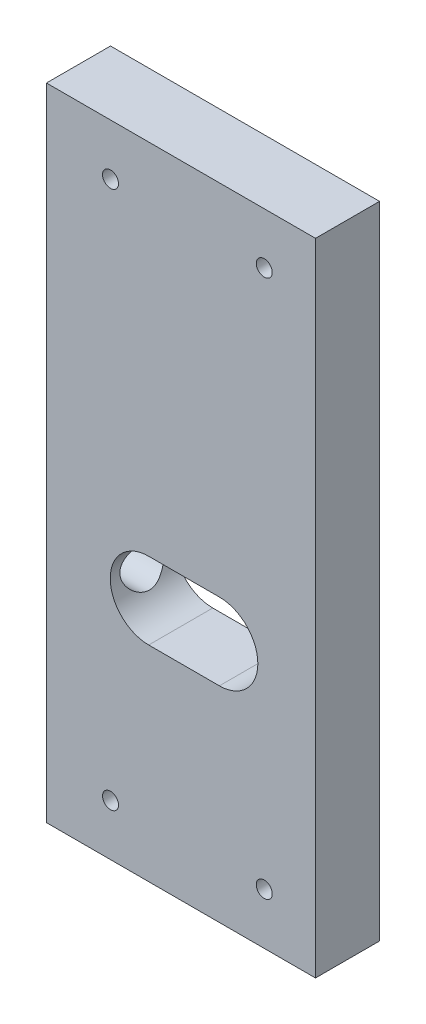
ISO-10303-21;
HEADER;
FILE_DESCRIPTION(('STEP AP214'),'2;1');
FILE_NAME('part.step','',(''),(''),'','','');
FILE_SCHEMA(('AUTOMOTIVE_DESIGN { 1 0 10303 214 1 1 1 1 }'));
ENDSEC;
DATA;
#1=APPLICATION_CONTEXT('core data for automotive mechanical design processes');
#2=APPLICATION_PROTOCOL_DEFINITION('international standard','automotive_design',2000,#1);
#3=PRODUCT_CONTEXT('',#1,'mechanical');
#4=PRODUCT('Part','Part','',(#3));
#5=PRODUCT_RELATED_PRODUCT_CATEGORY('part','',(#4));
#6=PRODUCT_DEFINITION_FORMATION('','',#4);
#7=PRODUCT_DEFINITION_CONTEXT('part definition',#1,'design');
#8=PRODUCT_DEFINITION('design','',#6,#7);
#9=PRODUCT_DEFINITION_SHAPE('','',#8);
#10=(LENGTH_UNIT() NAMED_UNIT(*) SI_UNIT(.MILLI.,.METRE.));
#11=(NAMED_UNIT(*) PLANE_ANGLE_UNIT() SI_UNIT($,.RADIAN.));
#12=(NAMED_UNIT(*) SI_UNIT($,.STERADIAN.) SOLID_ANGLE_UNIT());
#13=UNCERTAINTY_MEASURE_WITH_UNIT(LENGTH_MEASURE(1.E-05),#10,'distance_accuracy_value','');
#14=(GEOMETRIC_REPRESENTATION_CONTEXT(3) GLOBAL_UNCERTAINTY_ASSIGNED_CONTEXT((#13)) GLOBAL_UNIT_ASSIGNED_CONTEXT((#10,
#11,#12)) REPRESENTATION_CONTEXT('',''));
#15=CARTESIAN_POINT('',(0.,0.,0.));
#16=DIRECTION('',(0.,0.,1.));
#17=DIRECTION('',(1.,0.,0.));
#18=AXIS2_PLACEMENT_3D('',#15,#16,#17);
#19=CARTESIAN_POINT('',(21.,-50.,0.));
#20=DIRECTION('',(1.,0.,0.));
#21=DIRECTION('',(0.,0.,-1.));
#22=AXIS2_PLACEMENT_3D('',#19,#20,#21);
#23=PLANE('',#22);
#24=DIRECTION('',(0.,1.,0.));
#25=VECTOR('',#24,1.);
#26=CARTESIAN_POINT('',(21.,-50.,10.));
#27=LINE('',#26,#25);
#28=CARTESIAN_POINT('',(21.,-50.,10.));
#29=VERTEX_POINT('',#28);
#30=CARTESIAN_POINT('',(21.,50.,10.));
#31=VERTEX_POINT('',#30);
#32=EDGE_CURVE('E179',#29,#31,#27,.T.);
#33=ORIENTED_EDGE('',*,*,#32,.F.);
#34=DIRECTION('',(0.,0.,1.));
#35=VECTOR('',#34,1.);
#36=CARTESIAN_POINT('',(21.,-50.,0.));
#37=LINE('',#36,#35);
#38=CARTESIAN_POINT('',(21.,-50.,0.));
#39=VERTEX_POINT('',#38);
#40=EDGE_CURVE('E11',#39,#29,#37,.T.);
#41=ORIENTED_EDGE('',*,*,#40,.F.);
#42=DIRECTION('',(0.,1.,0.));
#43=VECTOR('',#42,1.);
#44=CARTESIAN_POINT('',(21.,-50.,0.));
#45=LINE('',#44,#43);
#46=CARTESIAN_POINT('',(21.,50.,0.));
#47=VERTEX_POINT('',#46);
#48=EDGE_CURVE('E195',#39,#47,#45,.T.);
#49=ORIENTED_EDGE('',*,*,#48,.T.);
#50=DIRECTION('',(0.,0.,1.));
#51=VECTOR('',#50,1.);
#52=CARTESIAN_POINT('',(21.,50.,0.));
#53=LINE('',#52,#51);
#54=EDGE_CURVE('E36',#47,#31,#53,.T.);
#55=ORIENTED_EDGE('',*,*,#54,.T.);
#56=EDGE_LOOP('',(#33,#41,#49,#55));
#57=FACE_BOUND('',#56,.T.);
#58=ADVANCED_FACE('F33',(#57),#23,.T.);
#59=CARTESIAN_POINT('',(-21.,-50.,0.));
#60=DIRECTION('',(0.,-1.,0.));
#61=DIRECTION('',(0.,0.,-1.));
#62=AXIS2_PLACEMENT_3D('',#59,#60,#61);
#63=PLANE('',#62);
#64=DIRECTION('',(1.,0.,0.));
#65=VECTOR('',#64,1.);
#66=CARTESIAN_POINT('',(-21.,-50.,10.));
#67=LINE('',#66,#65);
#68=CARTESIAN_POINT('',(-21.,-50.,10.));
#69=VERTEX_POINT('',#68);
#70=EDGE_CURVE('E191',#69,#29,#67,.T.);
#71=ORIENTED_EDGE('',*,*,#70,.F.);
#72=DIRECTION('',(0.,0.,1.));
#73=VECTOR('',#72,1.);
#74=CARTESIAN_POINT('',(-21.,-50.,0.));
#75=LINE('',#74,#73);
#76=CARTESIAN_POINT('',(-21.,-50.,0.));
#77=VERTEX_POINT('',#76);
#78=EDGE_CURVE('E41',#77,#69,#75,.T.);
#79=ORIENTED_EDGE('',*,*,#78,.F.);
#80=DIRECTION('',(1.,0.,0.));
#81=VECTOR('',#80,1.);
#82=CARTESIAN_POINT('',(-21.,-50.,0.));
#83=LINE('',#82,#81);
#84=EDGE_CURVE('E205',#77,#39,#83,.T.);
#85=ORIENTED_EDGE('',*,*,#84,.T.);
#86=ORIENTED_EDGE('',*,*,#40,.T.);
#87=EDGE_LOOP('',(#71,#79,#85,#86));
#88=FACE_BOUND('',#87,.T.);
#89=ADVANCED_FACE('F169',(#88),#63,.T.);
#90=CARTESIAN_POINT('',(-21.,50.,0.));
#91=DIRECTION('',(-1.,0.,0.));
#92=DIRECTION('',(0.,0.,1.));
#93=AXIS2_PLACEMENT_3D('',#90,#91,#92);
#94=PLANE('',#93);
#95=CARTESIAN_POINT('',(-21.,45.,5.));
#96=DIRECTION('',(-1.,0.,0.));
#97=DIRECTION('',(0.,0.,1.));
#98=AXIS2_PLACEMENT_3D('',#95,#96,#97);
#99=CIRCLE('',#98,1.24999999999999);
#100=CARTESIAN_POINT('',(-21.,45.,6.24999999999999));
#101=VERTEX_POINT('',#100);
#102=EDGE_CURVE('E113',#101,#101,#99,.T.);
#103=ORIENTED_EDGE('',*,*,#102,.F.);
#104=EDGE_LOOP('',(#103));
#105=FACE_BOUND('',#104,.T.);
#106=CARTESIAN_POINT('',(-21.,-45.,5.));
#107=DIRECTION('',(-1.,0.,0.));
#108=DIRECTION('',(0.,0.,1.));
#109=AXIS2_PLACEMENT_3D('',#106,#107,#108);
#110=CIRCLE('',#109,1.24999999999999);
#111=CARTESIAN_POINT('',(-21.,-45.,6.24999999999999));
#112=VERTEX_POINT('',#111);
#113=EDGE_CURVE('E112',#112,#112,#110,.T.);
#114=ORIENTED_EDGE('',*,*,#113,.F.);
#115=EDGE_LOOP('',(#114));
#116=FACE_BOUND('',#115,.T.);
#117=CARTESIAN_POINT('',(-21.,-12.,5.));
#118=DIRECTION('',(-1.,0.,0.));
#119=DIRECTION('',(0.,0.,1.));
#120=AXIS2_PLACEMENT_3D('',#117,#118,#119);
#121=CIRCLE('',#120,4.49999999999999);
#122=CARTESIAN_POINT('',(-21.,-12.,9.49999999999999));
#123=VERTEX_POINT('',#122);
#124=EDGE_CURVE('E123',#123,#123,#121,.T.);
#125=ORIENTED_EDGE('',*,*,#124,.F.);
#126=EDGE_LOOP('',(#125));
#127=FACE_BOUND('',#126,.T.);
#128=DIRECTION('',(0.,-1.,0.));
#129=VECTOR('',#128,1.);
#130=CARTESIAN_POINT('',(-21.,50.,10.));
#131=LINE('',#130,#129);
#132=CARTESIAN_POINT('',(-21.,50.,10.));
#133=VERTEX_POINT('',#132);
#134=EDGE_CURVE('E194',#133,#69,#131,.T.);
#135=ORIENTED_EDGE('',*,*,#134,.F.);
#136=DIRECTION('',(0.,0.,1.));
#137=VECTOR('',#136,1.);
#138=CARTESIAN_POINT('',(-21.,50.,0.));
#139=LINE('',#138,#137);
#140=CARTESIAN_POINT('',(-21.,50.,0.));
#141=VERTEX_POINT('',#140);
#142=EDGE_CURVE('E202',#141,#133,#139,.T.);
#143=ORIENTED_EDGE('',*,*,#142,.F.);
#144=DIRECTION('',(0.,-1.,0.));
#145=VECTOR('',#144,1.);
#146=CARTESIAN_POINT('',(-21.,50.,0.));
#147=LINE('',#146,#145);
#148=EDGE_CURVE('E207',#141,#77,#147,.T.);
#149=ORIENTED_EDGE('',*,*,#148,.T.);
#150=ORIENTED_EDGE('',*,*,#78,.T.);
#151=EDGE_LOOP('',(#135,#143,#149,#150));
#152=FACE_BOUND('',#151,.T.);
#153=ADVANCED_FACE('F174',(#105,#116,#127,#152),#94,.T.);
#154=CARTESIAN_POINT('',(21.,50.,0.));
#155=DIRECTION('',(0.,1.,0.));
#156=DIRECTION('',(0.,0.,1.));
#157=AXIS2_PLACEMENT_3D('',#154,#155,#156);
#158=PLANE('',#157);
#159=DIRECTION('',(-1.,0.,0.));
#160=VECTOR('',#159,1.);
#161=CARTESIAN_POINT('',(21.,50.,10.));
#162=LINE('',#161,#160);
#163=EDGE_CURVE('E186',#31,#133,#162,.T.);
#164=ORIENTED_EDGE('',*,*,#163,.F.);
#165=ORIENTED_EDGE('',*,*,#54,.F.);
#166=DIRECTION('',(-1.,0.,0.));
#167=VECTOR('',#166,1.);
#168=CARTESIAN_POINT('',(21.,50.,0.));
#169=LINE('',#168,#167);
#170=EDGE_CURVE('E197',#47,#141,#169,.T.);
#171=ORIENTED_EDGE('',*,*,#170,.T.);
#172=ORIENTED_EDGE('',*,*,#142,.T.);
#173=EDGE_LOOP('',(#164,#165,#171,#172));
#174=FACE_BOUND('',#173,.T.);
#175=ADVANCED_FACE('F213',(#174),#158,.T.);
#176=CARTESIAN_POINT('',(0.,0.,0.));
#177=DIRECTION('',(0.,0.,1.));
#178=DIRECTION('',(1.,0.,0.));
#179=AXIS2_PLACEMENT_3D('',#176,#177,#178);
#180=PLANE('',#179);
#181=CARTESIAN_POINT('',(13.,42.,0.));
#182=DIRECTION('',(0.,0.,1.));
#183=DIRECTION('',(1.,0.,0.));
#184=AXIS2_PLACEMENT_3D('',#181,#182,#183);
#185=CIRCLE('',#184,1.24999999999998);
#186=CARTESIAN_POINT('',(14.25,42.,0.));
#187=VERTEX_POINT('',#186);
#188=EDGE_CURVE('E263',#187,#187,#185,.T.);
#189=ORIENTED_EDGE('',*,*,#188,.T.);
#190=EDGE_LOOP('',(#189));
#191=FACE_BOUND('',#190,.T.);
#192=CARTESIAN_POINT('',(-11.,42.,0.));
#193=DIRECTION('',(0.,0.,1.));
#194=DIRECTION('',(1.,0.,0.));
#195=AXIS2_PLACEMENT_3D('',#192,#193,#194);
#196=CIRCLE('',#195,1.24999999999998);
#197=CARTESIAN_POINT('',(-9.75000000000003,42.,0.));
#198=VERTEX_POINT('',#197);
#199=EDGE_CURVE('E258',#198,#198,#196,.T.);
#200=ORIENTED_EDGE('',*,*,#199,.T.);
#201=EDGE_LOOP('',(#200));
#202=FACE_BOUND('',#201,.T.);
#203=CARTESIAN_POINT('',(-11.,-42.,0.));
#204=DIRECTION('',(0.,0.,1.));
#205=DIRECTION('',(1.,0.,0.));
#206=AXIS2_PLACEMENT_3D('',#203,#204,#205);
#207=CIRCLE('',#206,1.24999999999998);
#208=CARTESIAN_POINT('',(-9.75000000000003,-42.,0.));
#209=VERTEX_POINT('',#208);
#210=EDGE_CURVE('E252',#209,#209,#207,.T.);
#211=ORIENTED_EDGE('',*,*,#210,.T.);
#212=EDGE_LOOP('',(#211));
#213=FACE_BOUND('',#212,.T.);
#214=CARTESIAN_POINT('',(13.,-42.,0.));
#215=DIRECTION('',(0.,0.,1.));
#216=DIRECTION('',(1.,0.,0.));
#217=AXIS2_PLACEMENT_3D('',#214,#215,#216);
#218=CIRCLE('',#217,1.24999999999998);
#219=CARTESIAN_POINT('',(14.25,-42.,0.));
#220=VERTEX_POINT('',#219);
#221=EDGE_CURVE('E238',#220,#220,#218,.T.);
#222=ORIENTED_EDGE('',*,*,#221,.T.);
#223=EDGE_LOOP('',(#222));
#224=FACE_BOUND('',#223,.T.);
#225=DIRECTION('',(1.,0.,0.));
#226=VECTOR('',#225,1.);
#227=CARTESIAN_POINT('',(-5.04,-6.,0.));
#228=LINE('',#227,#226);
#229=CARTESIAN_POINT('',(-5.04,-6.,0.));
#230=VERTEX_POINT('',#229);
#231=CARTESIAN_POINT('',(5.99999999999999,-6.,0.));
#232=VERTEX_POINT('',#231);
#233=EDGE_CURVE('E234',#230,#232,#228,.T.);
#234=ORIENTED_EDGE('',*,*,#233,.F.);
#235=CARTESIAN_POINT('',(-5.04,-12.,0.));
#236=DIRECTION('',(0.,0.,-1.));
#237=DIRECTION('',(-1.,0.,0.));
#238=AXIS2_PLACEMENT_3D('',#235,#236,#237);
#239=CIRCLE('',#238,6.00000000000001);
#240=CARTESIAN_POINT('',(-5.04,-18.,0.));
#241=VERTEX_POINT('',#240);
#242=EDGE_CURVE('E49',#241,#230,#239,.T.);
#243=ORIENTED_EDGE('',*,*,#242,.F.);
#244=DIRECTION('',(-1.,0.,0.));
#245=VECTOR('',#244,1.);
#246=CARTESIAN_POINT('',(5.99999999999999,-18.,0.));
#247=LINE('',#246,#245);
#248=CARTESIAN_POINT('',(6.,-18.,0.));
#249=VERTEX_POINT('',#248);
#250=EDGE_CURVE('E227',#249,#241,#247,.T.);
#251=ORIENTED_EDGE('',*,*,#250,.F.);
#252=CARTESIAN_POINT('',(5.99999999999999,-12.,0.));
#253=DIRECTION('',(0.,0.,-1.));
#254=DIRECTION('',(-1.,0.,0.));
#255=AXIS2_PLACEMENT_3D('',#252,#253,#254);
#256=CIRCLE('',#255,6.00000000000001);
#257=EDGE_CURVE('E231',#232,#249,#256,.T.);
#258=ORIENTED_EDGE('',*,*,#257,.F.);
#259=EDGE_LOOP('',(#234,#243,#251,#258));
#260=FACE_BOUND('',#259,.T.);
#261=ORIENTED_EDGE('',*,*,#48,.F.);
#262=ORIENTED_EDGE('',*,*,#84,.F.);
#263=ORIENTED_EDGE('',*,*,#148,.F.);
#264=ORIENTED_EDGE('',*,*,#170,.F.);
#265=EDGE_LOOP('',(#261,#262,#263,#264));
#266=FACE_BOUND('',#265,.T.);
#267=ADVANCED_FACE('F217',(#191,#202,#213,#224,#260,#266),#180,.F.);
#268=CARTESIAN_POINT('',(0.,0.,10.));
#269=DIRECTION('',(0.,0.,1.));
#270=DIRECTION('',(1.,0.,0.));
#271=AXIS2_PLACEMENT_3D('',#268,#269,#270);
#272=PLANE('',#271);
#273=CARTESIAN_POINT('',(13.,42.,10.));
#274=DIRECTION('',(0.,0.,1.));
#275=DIRECTION('',(1.,0.,0.));
#276=AXIS2_PLACEMENT_3D('',#273,#274,#275);
#277=CIRCLE('',#276,1.24999999999998);
#278=CARTESIAN_POINT('',(14.25,42.,10.));
#279=VERTEX_POINT('',#278);
#280=EDGE_CURVE('E139',#279,#279,#277,.T.);
#281=ORIENTED_EDGE('',*,*,#280,.F.);
#282=EDGE_LOOP('',(#281));
#283=FACE_BOUND('',#282,.T.);
#284=CARTESIAN_POINT('',(-11.,42.,10.));
#285=DIRECTION('',(0.,0.,1.));
#286=DIRECTION('',(1.,0.,0.));
#287=AXIS2_PLACEMENT_3D('',#284,#285,#286);
#288=CIRCLE('',#287,1.24999999999998);
#289=CARTESIAN_POINT('',(-9.75000000000002,42.,10.));
#290=VERTEX_POINT('',#289);
#291=EDGE_CURVE('E261',#290,#290,#288,.T.);
#292=ORIENTED_EDGE('',*,*,#291,.F.);
#293=EDGE_LOOP('',(#292));
#294=FACE_BOUND('',#293,.T.);
#295=CARTESIAN_POINT('',(-11.,-42.,10.));
#296=DIRECTION('',(0.,0.,1.));
#297=DIRECTION('',(1.,0.,0.));
#298=AXIS2_PLACEMENT_3D('',#295,#296,#297);
#299=CIRCLE('',#298,1.24999999999998);
#300=CARTESIAN_POINT('',(-9.75000000000003,-42.,10.));
#301=VERTEX_POINT('',#300);
#302=EDGE_CURVE('E255',#301,#301,#299,.T.);
#303=ORIENTED_EDGE('',*,*,#302,.F.);
#304=EDGE_LOOP('',(#303));
#305=FACE_BOUND('',#304,.T.);
#306=CARTESIAN_POINT('',(13.,-42.,10.));
#307=DIRECTION('',(0.,0.,1.));
#308=DIRECTION('',(1.,0.,0.));
#309=AXIS2_PLACEMENT_3D('',#306,#307,#308);
#310=CIRCLE('',#309,1.24999999999998);
#311=CARTESIAN_POINT('',(14.25,-42.,10.));
#312=VERTEX_POINT('',#311);
#313=EDGE_CURVE('E249',#312,#312,#310,.T.);
#314=ORIENTED_EDGE('',*,*,#313,.F.);
#315=EDGE_LOOP('',(#314));
#316=FACE_BOUND('',#315,.T.);
#317=CARTESIAN_POINT('',(-5.04,-12.,10.));
#318=DIRECTION('',(0.,0.,-1.));
#319=DIRECTION('',(-1.,0.,0.));
#320=AXIS2_PLACEMENT_3D('',#317,#318,#319);
#321=CIRCLE('',#320,6.00000000000001);
#322=CARTESIAN_POINT('',(-5.04,-18.,10.));
#323=VERTEX_POINT('',#322);
#324=CARTESIAN_POINT('',(-5.04,-6.,10.));
#325=VERTEX_POINT('',#324);
#326=EDGE_CURVE('E230',#323,#325,#321,.T.);
#327=ORIENTED_EDGE('',*,*,#326,.T.);
#328=DIRECTION('',(1.,0.,0.));
#329=VECTOR('',#328,1.);
#330=CARTESIAN_POINT('',(-5.04,-6.,10.));
#331=LINE('',#330,#329);
#332=CARTESIAN_POINT('',(5.99999999999999,-6.,10.));
#333=VERTEX_POINT('',#332);
#334=EDGE_CURVE('E242',#325,#333,#331,.T.);
#335=ORIENTED_EDGE('',*,*,#334,.T.);
#336=CARTESIAN_POINT('',(5.99999999999999,-12.,10.));
#337=DIRECTION('',(0.,0.,-1.));
#338=DIRECTION('',(-1.,0.,0.));
#339=AXIS2_PLACEMENT_3D('',#336,#337,#338);
#340=CIRCLE('',#339,6.00000000000001);
#341=CARTESIAN_POINT('',(6.,-18.,10.));
#342=VERTEX_POINT('',#341);
#343=EDGE_CURVE('E57',#333,#342,#340,.T.);
#344=ORIENTED_EDGE('',*,*,#343,.T.);
#345=DIRECTION('',(-1.,0.,0.));
#346=VECTOR('',#345,1.);
#347=CARTESIAN_POINT('',(5.99999999999999,-18.,10.));
#348=LINE('',#347,#346);
#349=EDGE_CURVE('E222',#342,#323,#348,.T.);
#350=ORIENTED_EDGE('',*,*,#349,.T.);
#351=EDGE_LOOP('',(#327,#335,#344,#350));
#352=FACE_BOUND('',#351,.T.);
#353=ORIENTED_EDGE('',*,*,#32,.T.);
#354=ORIENTED_EDGE('',*,*,#163,.T.);
#355=ORIENTED_EDGE('',*,*,#134,.T.);
#356=ORIENTED_EDGE('',*,*,#70,.T.);
#357=EDGE_LOOP('',(#353,#354,#355,#356));
#358=FACE_BOUND('',#357,.T.);
#359=ADVANCED_FACE('F192',(#283,#294,#305,#316,#352,#358),#272,.T.);
#360=CARTESIAN_POINT('',(-5.04,-12.,10.));
#361=DIRECTION('',(0.,0.,-1.));
#362=DIRECTION('',(-1.,0.,0.));
#363=AXIS2_PLACEMENT_3D('',#360,#361,#362);
#364=CYLINDRICAL_SURFACE('',#363,6.00000000000001);
#365=CARTESIAN_POINT('',(-11.04,-12.,8.5));
#366=CARTESIAN_POINT('',(-11.0399994070553,-11.9100378157983,8.499999344979));
#367=CARTESIAN_POINT('',(-11.0379711327434,-11.8200408765279,8.49652549070914));
#368=CARTESIAN_POINT('',(-11.0299069974074,-11.6407208184946,8.48267375145588));
#369=CARTESIAN_POINT('',(-11.0238683988951,-11.5513982021831,8.47229115048177));
#370=CARTESIAN_POINT('',(-11.0079150378068,-11.3739517567366,8.44472607587532));
#371=CARTESIAN_POINT('',(-10.9979918460717,-11.2858309686807,8.42752881414367));
#372=CARTESIAN_POINT('',(-10.9745188371261,-11.1116118038523,8.38656029192718));
#373=CARTESIAN_POINT('',(-10.960967457018,-11.0255143160743,8.36278619822453));
#374=CARTESIAN_POINT('',(-10.9154904410828,-10.7720480630621,8.28228254868244));
#375=CARTESIAN_POINT('',(-10.8786385779637,-10.6084208891931,8.21619899902307));
#376=CARTESIAN_POINT('',(-10.7949850028421,-10.2951469376239,8.06170731941832));
#377=CARTESIAN_POINT('',(-10.7481866893732,-10.1454954097584,7.97330681286644));
#378=CARTESIAN_POINT('',(-10.6445521054124,-9.85174795611084,7.76934942490433));
#379=CARTESIAN_POINT('',(-10.5872290749499,-9.70888458664958,7.65226606318091));
#380=CARTESIAN_POINT('',(-10.4701030544073,-9.44362333211176,7.39766667401416));
#381=CARTESIAN_POINT('',(-10.4102970599595,-9.32125119852179,7.26012534051895));
#382=CARTESIAN_POINT('',(-10.286878657809,-9.08627354019784,6.9499418739621));
#383=CARTESIAN_POINT('',(-10.2236132817486,-8.976386012937,6.77508434232938));
#384=CARTESIAN_POINT('',(-10.1090570156485,-8.78801044290042,6.40567797214929));
#385=CARTESIAN_POINT('',(-10.0577474184173,-8.70947320715023,6.21116058858183));
#386=CARTESIAN_POINT('',(-9.98524723148708,-8.6018040561688,5.85362266177146));
#387=CARTESIAN_POINT('',(-9.95984581185327,-8.56546814719895,5.69362774822004));
#388=CARTESIAN_POINT('',(-9.92464999348732,-8.51558237252985,5.36851077352308));
#389=CARTESIAN_POINT('',(-9.91483780508295,-8.50200653316751,5.20339477609203));
#390=CARTESIAN_POINT('',(-9.91225207387588,-8.49840498599784,4.87250765848925));
#391=CARTESIAN_POINT('',(-9.91950571853605,-8.50841685564479,4.70673591356244));
#392=CARTESIAN_POINT('',(-9.95001053927536,-8.55145552375672,4.37968395128125));
#393=CARTESIAN_POINT('',(-9.97327315695063,-8.58449878294818,4.21840703220671));
#394=CARTESIAN_POINT('',(-10.0324352201292,-8.67159181935784,3.90551007740121));
#395=CARTESIAN_POINT('',(-10.0682404067617,-8.72548521242197,3.75382770797726));
#396=CARTESIAN_POINT('',(-10.1486222665979,-8.85236443412476,3.46121540476717));
#397=CARTESIAN_POINT('',(-10.1932022375361,-8.92535744417787,3.32028954120326));
#398=CARTESIAN_POINT('',(-10.2950872688664,-9.10239460175391,3.02828062995961));
#399=CARTESIAN_POINT('',(-10.3532754100333,-9.20958456146782,2.87940953620583));
#400=CARTESIAN_POINT('',(-10.4706982627465,-9.44560207864495,2.60030615153667));
#401=CARTESIAN_POINT('',(-10.529933870597,-9.57444905781381,2.47009078671601));
#402=CARTESIAN_POINT('',(-10.6514876441656,-9.86937289581381,2.21561404503905));
#403=CARTESIAN_POINT('',(-10.7132769139984,-10.0380852567778,2.09409422941143));
#404=CARTESIAN_POINT('',(-10.7970400122716,-10.3072538637461,1.93478847963492));
#405=CARTESIAN_POINT('',(-10.8234832925862,-10.3997014633555,1.88550000132137));
#406=CARTESIAN_POINT('',(-10.8726567590854,-10.5894364784309,1.79510843850777));
#407=CARTESIAN_POINT('',(-10.8953892127255,-10.6867208906482,1.75400035208943));
#408=CARTESIAN_POINT('',(-10.9350760463397,-10.8788159718847,1.68296390008847));
#409=CARTESIAN_POINT('',(-10.9523142142613,-10.9733606451319,1.65247371851614));
#410=CARTESIAN_POINT('',(-10.9824499491055,-11.1653047155916,1.59953151504972));
#411=CARTESIAN_POINT('',(-10.9953498923423,-11.262702518078,1.57707509213725));
#412=CARTESIAN_POINT('',(-11.0164241705081,-11.4594994751207,1.5405392556298));
#413=CARTESIAN_POINT('',(-11.0246015026412,-11.5588973188033,1.52645452877361));
#414=CARTESIAN_POINT('',(-11.0359861323585,-11.7588124785264,1.50687624700017));
#415=CARTESIAN_POINT('',(-11.0391940422435,-11.8593296551124,1.50138163366256));
#416=CARTESIAN_POINT('',(-11.040452294855,-12.0476500287329,1.49922465385498));
#417=CARTESIAN_POINT('',(-11.0391086274551,-12.1354385908485,1.50152455820664));
#418=CARTESIAN_POINT('',(-11.0326040392711,-12.3104619933306,1.51269182949206));
#419=CARTESIAN_POINT('',(-11.0274419310595,-12.3976966529362,1.52156123935841));
#420=CARTESIAN_POINT('',(-11.0063826228672,-12.6575200995123,1.55788512114811));
#421=CARTESIAN_POINT('',(-10.9849133619105,-12.8284226899773,1.59505335352384));
#422=CARTESIAN_POINT('',(-10.9295184376044,-13.1580887666669,1.69273559942258));
#423=CARTESIAN_POINT('',(-10.8957943931415,-13.3170011031745,1.75287250114682));
#424=CARTESIAN_POINT('',(-10.8185948595437,-13.6225544283877,1.89425308799117));
#425=CARTESIAN_POINT('',(-10.7751172089861,-13.7691926872231,1.9755014520946));
#426=CARTESIAN_POINT('',(-10.6767050584924,-14.0625033084342,2.1663068517907));
#427=CARTESIAN_POINT('',(-10.621048583978,-14.207584071372,2.27793260505315));
#428=CARTESIAN_POINT('',(-10.5063293339446,-14.4780793032594,2.52162906369722));
#429=CARTESIAN_POINT('',(-10.4472626498571,-14.6034705678037,2.65372353307513));
#430=CARTESIAN_POINT('',(-10.3238349558923,-14.8463608155606,2.95312112891092));
#431=CARTESIAN_POINT('',(-10.2596848827806,-14.9611255303948,3.12274539799034));
#432=CARTESIAN_POINT('',(-10.1415102747549,-15.1603882033844,3.48210071946081));
#433=CARTESIAN_POINT('',(-10.0874732945946,-15.2449234804068,3.67180660289635));
#434=CARTESIAN_POINT('',(-10.0077674406598,-15.3653142974805,4.02454779574634));
#435=CARTESIAN_POINT('',(-9.97849487756635,-15.4077341276548,4.18452221652442));
#436=CARTESIAN_POINT('',(-9.93523317923762,-15.4696049216783,4.51079093510767));
#437=CARTESIAN_POINT('',(-9.9212250317937,-15.489084460678,4.67707710357673));
#438=CARTESIAN_POINT('',(-9.91053514207999,-15.503995947564,5.0117532202431));
#439=CARTESIAN_POINT('',(-9.91389986973793,-15.4993633988364,5.18014760767355));
#440=CARTESIAN_POINT('',(-9.93753765573747,-15.4661953475754,5.51338781935982));
#441=CARTESIAN_POINT('',(-9.95782101824514,-15.4376452782114,5.67823141825647));
#442=CARTESIAN_POINT('',(-10.0115786997143,-15.3593965803486,5.99516134899973));
#443=CARTESIAN_POINT('',(-10.0446480690308,-15.310343767602,6.14748017565885));
#444=CARTESIAN_POINT('',(-10.1202614693704,-15.1930860678878,6.44199861353435));
#445=CARTESIAN_POINT('',(-10.1628090864806,-15.1248739294504,6.58419436775335));
#446=CARTESIAN_POINT('',(-10.2605985781158,-14.9590475392213,6.8779562012529));
#447=CARTESIAN_POINT('',(-10.3167858854007,-14.8585152484814,7.02756049479073));
#448=CARTESIAN_POINT('',(-10.4312804253615,-14.6362423687887,7.30921697519905));
#449=CARTESIAN_POINT('',(-10.4895892908983,-14.5144851586301,7.44125526220365));
#450=CARTESIAN_POINT('',(-10.611439176035,-14.232862194456,7.70299413509767));
#451=CARTESIAN_POINT('',(-10.6745680250106,-14.070047031118,7.82977305151315));
#452=CARTESIAN_POINT('',(-10.7614720337896,-13.8092066672913,7.99791924302712));
#453=CARTESIAN_POINT('',(-10.7891607827264,-13.7194120549624,8.05033058248406));
#454=CARTESIAN_POINT('',(-10.8411789185814,-13.5347626197252,8.14727760192882));
#455=CARTESIAN_POINT('',(-10.8655102617016,-13.4399107884699,8.19181787230004));
#456=CARTESIAN_POINT('',(-10.9090478430384,-13.2503181772042,8.27058817523679));
#457=CARTESIAN_POINT('',(-10.9284406963213,-13.1557801073015,8.30520328441335));
#458=CARTESIAN_POINT('',(-10.9629547295174,-12.9634032507232,8.36630793151274));
#459=CARTESIAN_POINT('',(-10.9780783930216,-12.8655664203347,8.39280219449156));
#460=CARTESIAN_POINT('',(-11.0035669553182,-12.6676778783572,8.43721698560878));
#461=CARTESIAN_POINT('',(-11.0139462261897,-12.5676338313999,8.45516341453392));
#462=CARTESIAN_POINT('',(-11.0296765248691,-12.3660313634925,8.48229068095121));
#463=CARTESIAN_POINT('',(-11.0350320468426,-12.2644743787892,8.49147935311126));
#464=CARTESIAN_POINT('',(-11.0385289781034,-12.1356008428426,8.49747764565677));
#465=CARTESIAN_POINT('',(-11.0390803376536,-12.1084933911825,8.4984232282245));
#466=CARTESIAN_POINT('',(-11.039815939579,-12.0542583467886,8.49968450685542));
#467=CARTESIAN_POINT('',(-11.04000017882,-12.0271307538848,8.50000019754093));
#468=CARTESIAN_POINT('',(-11.04,-12.,8.5));
#469=B_SPLINE_CURVE_WITH_KNOTS('',3,(#365,#366,#367,#368,#369,#370,#371,#372,#373,#374,#375,
#376,#377,#378,#379,#380,#381,#382,#383,#384,#385,#386,#387,#388,#389,#390,#391,#392,#393,#394,
#395,#396,#397,#398,#399,#400,#401,#402,#403,#404,#405,#406,#407,#408,#409,#410,#411,#412,#413,
#414,#415,#416,#417,#418,#419,#420,#421,#422,#423,#424,#425,#426,#427,#428,#429,#430,#431,#432,
#433,#434,#435,#436,#437,#438,#439,#440,#441,#442,#443,#444,#445,#446,#447,#448,#449,#450,#451,
#452,#453,#454,#455,#456,#457,#458,#459,#460,#461,#462,#463,#464,#465,#466,#467,#468),
.UNSPECIFIED.,.T.,.F.,(4,2,2,2,2,2,2,2,2,2,2,2,2,2,2,2,2,2,2,2,2,2,2,2,2,2,2,2,2,2,2,2,2,2,2,2,
2,2,2,2,2,2,2,2,2,2,2,2,2,2,2,4),(0.,0.269857022230554,0.539898441223982,0.810529098989633,
1.08127652312956,1.61950432452768,2.15754851740578,2.73544583741866,3.31406404167448,
3.9588634393916,4.60264704184034,5.09858348127048,5.59395357461927,6.0901133729436,
6.58662814492187,7.07948888602378,7.57253520864789,8.14762469114196,8.72323268451364,
9.37023224992074,9.69399877078185,10.0175667114709,10.3196086145675,10.6214848001053,
10.9231691888501,11.2248164029905,11.4879654567385,11.7511963768611,12.2770829521784,
12.7946826161502,13.3123970949539,13.8841084077748,14.4564885153885,15.097275939432,
15.737269544695,16.2393630156573,16.7408303993928,17.2436398295979,17.746755715859,
18.2350938681074,18.7236170974388,19.2878323305452,19.8524914011331,20.4962952131074,
20.8187115384658,21.1409392065765,21.4480807758936,21.7550432963678,22.0610696775496,
22.3668220305959,22.4482046916947,22.5295880475924),.UNSPECIFIED.);
#470=CARTESIAN_POINT('',(-11.04,-12.,8.5));
#471=VERTEX_POINT('',#470);
#472=EDGE_CURVE('E132',#471,#471,#469,.T.);
#473=ORIENTED_EDGE('',*,*,#472,.T.);
#474=EDGE_LOOP('',(#473));
#475=FACE_BOUND('',#474,.T.);
#476=ORIENTED_EDGE('',*,*,#242,.T.);
#477=DIRECTION('',(0.,0.,-1.));
#478=VECTOR('',#477,1.);
#479=CARTESIAN_POINT('',(-5.04,-6.,10.));
#480=LINE('',#479,#478);
#481=EDGE_CURVE('E219',#325,#230,#480,.T.);
#482=ORIENTED_EDGE('',*,*,#481,.F.);
#483=ORIENTED_EDGE('',*,*,#326,.F.);
#484=DIRECTION('',(0.,0.,-1.));
#485=VECTOR('',#484,1.);
#486=CARTESIAN_POINT('',(-5.04,-18.,10.));
#487=LINE('',#486,#485);
#488=EDGE_CURVE('E187',#323,#241,#487,.T.);
#489=ORIENTED_EDGE('',*,*,#488,.T.);
#490=EDGE_LOOP('',(#476,#482,#483,#489));
#491=FACE_BOUND('',#490,.T.);
#492=ADVANCED_FACE('F273',(#475,#491),#364,.F.);
#493=CARTESIAN_POINT('',(5.99999999999999,-18.,10.));
#494=DIRECTION('',(0.,-1.,0.));
#495=DIRECTION('',(0.,0.,-1.));
#496=AXIS2_PLACEMENT_3D('',#493,#494,#495);
#497=PLANE('',#496);
#498=ORIENTED_EDGE('',*,*,#250,.T.);
#499=ORIENTED_EDGE('',*,*,#488,.F.);
#500=ORIENTED_EDGE('',*,*,#349,.F.);
#501=DIRECTION('',(0.,0.,-1.));
#502=VECTOR('',#501,1.);
#503=CARTESIAN_POINT('',(6.,-18.,10.));
#504=LINE('',#503,#502);
#505=EDGE_CURVE('E224',#342,#249,#504,.T.);
#506=ORIENTED_EDGE('',*,*,#505,.T.);
#507=EDGE_LOOP('',(#498,#499,#500,#506));
#508=FACE_BOUND('',#507,.T.);
#509=ADVANCED_FACE('F292',(#508),#497,.F.);
#510=CARTESIAN_POINT('',(5.99999999999999,-12.,10.));
#511=DIRECTION('',(0.,0.,-1.));
#512=DIRECTION('',(-1.,0.,0.));
#513=AXIS2_PLACEMENT_3D('',#510,#511,#512);
#514=CYLINDRICAL_SURFACE('',#513,6.00000000000001);
#515=ORIENTED_EDGE('',*,*,#257,.T.);
#516=ORIENTED_EDGE('',*,*,#505,.F.);
#517=ORIENTED_EDGE('',*,*,#343,.F.);
#518=DIRECTION('',(0.,0.,-1.));
#519=VECTOR('',#518,1.);
#520=CARTESIAN_POINT('',(5.99999999999999,-6.,10.));
#521=LINE('',#520,#519);
#522=EDGE_CURVE('E221',#333,#232,#521,.T.);
#523=ORIENTED_EDGE('',*,*,#522,.T.);
#524=EDGE_LOOP('',(#515,#516,#517,#523));
#525=FACE_BOUND('',#524,.T.);
#526=ADVANCED_FACE('F288',(#525),#514,.F.);
#527=CARTESIAN_POINT('',(-5.04,-6.,10.));
#528=DIRECTION('',(0.,1.,0.));
#529=DIRECTION('',(-1.,0.,0.));
#530=AXIS2_PLACEMENT_3D('',#527,#528,#529);
#531=PLANE('',#530);
#532=ORIENTED_EDGE('',*,*,#233,.T.);
#533=ORIENTED_EDGE('',*,*,#522,.F.);
#534=ORIENTED_EDGE('',*,*,#334,.F.);
#535=ORIENTED_EDGE('',*,*,#481,.T.);
#536=EDGE_LOOP('',(#532,#533,#534,#535));
#537=FACE_BOUND('',#536,.T.);
#538=ADVANCED_FACE('F286',(#537),#531,.F.);
#539=CARTESIAN_POINT('',(13.,-42.,10.));
#540=DIRECTION('',(0.,0.,1.));
#541=DIRECTION('',(1.,0.,0.));
#542=AXIS2_PLACEMENT_3D('',#539,#540,#541);
#543=CYLINDRICAL_SURFACE('',#542,1.24999999999998);
#544=ORIENTED_EDGE('',*,*,#221,.F.);
#545=EDGE_LOOP('',(#544));
#546=FACE_BOUND('',#545,.T.);
#547=ORIENTED_EDGE('',*,*,#313,.T.);
#548=EDGE_LOOP('',(#547));
#549=FACE_BOUND('',#548,.T.);
#550=ADVANCED_FACE('F303',(#546,#549),#543,.F.);
#551=CARTESIAN_POINT('',(-11.,-42.,10.));
#552=DIRECTION('',(0.,0.,1.));
#553=DIRECTION('',(1.,0.,0.));
#554=AXIS2_PLACEMENT_3D('',#551,#552,#553);
#555=CYLINDRICAL_SURFACE('',#554,1.24999999999998);
#556=ORIENTED_EDGE('',*,*,#210,.F.);
#557=EDGE_LOOP('',(#556));
#558=FACE_BOUND('',#557,.T.);
#559=ORIENTED_EDGE('',*,*,#302,.T.);
#560=EDGE_LOOP('',(#559));
#561=FACE_BOUND('',#560,.T.);
#562=ADVANCED_FACE('F407',(#558,#561),#555,.F.);
#563=CARTESIAN_POINT('',(-11.,42.,10.));
#564=DIRECTION('',(0.,0.,1.));
#565=DIRECTION('',(1.,0.,0.));
#566=AXIS2_PLACEMENT_3D('',#563,#564,#565);
#567=CYLINDRICAL_SURFACE('',#566,1.24999999999998);
#568=ORIENTED_EDGE('',*,*,#199,.F.);
#569=EDGE_LOOP('',(#568));
#570=FACE_BOUND('',#569,.T.);
#571=ORIENTED_EDGE('',*,*,#291,.T.);
#572=EDGE_LOOP('',(#571));
#573=FACE_BOUND('',#572,.T.);
#574=ADVANCED_FACE('F403',(#570,#573),#567,.F.);
#575=CARTESIAN_POINT('',(13.,42.,10.));
#576=DIRECTION('',(0.,0.,1.));
#577=DIRECTION('',(1.,0.,0.));
#578=AXIS2_PLACEMENT_3D('',#575,#576,#577);
#579=CYLINDRICAL_SURFACE('',#578,1.24999999999998);
#580=ORIENTED_EDGE('',*,*,#188,.F.);
#581=EDGE_LOOP('',(#580));
#582=FACE_BOUND('',#581,.T.);
#583=ORIENTED_EDGE('',*,*,#280,.T.);
#584=EDGE_LOOP('',(#583));
#585=FACE_BOUND('',#584,.T.);
#586=ADVANCED_FACE('F148',(#582,#585),#579,.F.);
#587=CARTESIAN_POINT('',(-21.,-12.,5.));
#588=DIRECTION('',(-1.,0.,0.));
#589=DIRECTION('',(0.,0.,1.));
#590=AXIS2_PLACEMENT_3D('',#587,#588,#589);
#591=CYLINDRICAL_SURFACE('',#590,3.5);
#592=ORIENTED_EDGE('',*,*,#472,.F.);
#593=EDGE_LOOP('',(#592));
#594=FACE_BOUND('',#593,.T.);
#595=CARTESIAN_POINT('',(-16.,-12.,5.));
#596=DIRECTION('',(-1.,0.,0.));
#597=DIRECTION('',(0.,0.,1.));
#598=AXIS2_PLACEMENT_3D('',#595,#596,#597);
#599=CIRCLE('',#598,3.50000000000001);
#600=CARTESIAN_POINT('',(-16.,-12.,8.50000000000001));
#601=VERTEX_POINT('',#600);
#602=EDGE_CURVE('E129',#601,#601,#599,.T.);
#603=ORIENTED_EDGE('',*,*,#602,.T.);
#604=EDGE_LOOP('',(#603));
#605=FACE_BOUND('',#604,.T.);
#606=ADVANCED_FACE('F143',(#594,#605),#591,.F.);
#607=CARTESIAN_POINT('',(-16.,-8.5,5.));
#608=DIRECTION('',(1.,0.,0.));
#609=DIRECTION('',(0.,0.,-1.));
#610=AXIS2_PLACEMENT_3D('',#607,#608,#609);
#611=PLANE('',#610);
#612=ORIENTED_EDGE('',*,*,#602,.F.);
#613=EDGE_LOOP('',(#612));
#614=FACE_BOUND('',#613,.T.);
#615=CARTESIAN_POINT('',(-16.,-12.,5.));
#616=DIRECTION('',(-1.,0.,0.));
#617=DIRECTION('',(0.,0.,1.));
#618=AXIS2_PLACEMENT_3D('',#615,#616,#617);
#619=CIRCLE('',#618,4.49999999999999);
#620=CARTESIAN_POINT('',(-16.,-12.,9.49999999999999));
#621=VERTEX_POINT('',#620);
#622=EDGE_CURVE('E126',#621,#621,#619,.T.);
#623=ORIENTED_EDGE('',*,*,#622,.T.);
#624=EDGE_LOOP('',(#623));
#625=FACE_BOUND('',#624,.T.);
#626=ADVANCED_FACE('F147',(#614,#625),#611,.F.);
#627=CARTESIAN_POINT('',(-21.,-12.,5.));
#628=DIRECTION('',(-1.,0.,0.));
#629=DIRECTION('',(0.,0.,1.));
#630=AXIS2_PLACEMENT_3D('',#627,#628,#629);
#631=CYLINDRICAL_SURFACE('',#630,4.49999999999999);
#632=ORIENTED_EDGE('',*,*,#622,.F.);
#633=EDGE_LOOP('',(#632));
#634=FACE_BOUND('',#633,.T.);
#635=ORIENTED_EDGE('',*,*,#124,.T.);
#636=EDGE_LOOP('',(#635));
#637=FACE_BOUND('',#636,.T.);
#638=ADVANCED_FACE('F152',(#634,#637),#631,.F.);
#639=CARTESIAN_POINT('',(-13.5,-45.,5.));
#640=DIRECTION('',(-1.,0.,0.));
#641=DIRECTION('',(0.,0.,1.));
#642=AXIS2_PLACEMENT_3D('',#639,#640,#641);
#643=CONICAL_SURFACE('',#642,1.24999999999999,1.02974425863857);
#644=CARTESIAN_POINT('',(-12.7489242261508,-45.,5.));
#645=VERTEX_POINT('',#644);
#646=VERTEX_LOOP('',#645);
#647=FACE_BOUND('',#646,.T.);
#648=CARTESIAN_POINT('',(-13.5,-45.,5.));
#649=DIRECTION('',(-1.,0.,0.));
#650=DIRECTION('',(0.,0.,1.));
#651=AXIS2_PLACEMENT_3D('',#648,#649,#650);
#652=CIRCLE('',#651,1.24999999999999);
#653=CARTESIAN_POINT('',(-13.5,-45.,6.24999999999999));
#654=VERTEX_POINT('',#653);
#655=EDGE_CURVE('E116',#654,#654,#652,.T.);
#656=ORIENTED_EDGE('',*,*,#655,.T.);
#657=EDGE_LOOP('',(#656));
#658=FACE_BOUND('',#657,.T.);
#659=ADVANCED_FACE('F156',(#647,#658),#643,.F.);
#660=CARTESIAN_POINT('',(-21.,-45.,5.));
#661=DIRECTION('',(-1.,0.,0.));
#662=DIRECTION('',(0.,0.,1.));
#663=AXIS2_PLACEMENT_3D('',#660,#661,#662);
#664=CYLINDRICAL_SURFACE('',#663,1.24999999999999);
#665=ORIENTED_EDGE('',*,*,#655,.F.);
#666=EDGE_LOOP('',(#665));
#667=FACE_BOUND('',#666,.T.);
#668=ORIENTED_EDGE('',*,*,#113,.T.);
#669=EDGE_LOOP('',(#668));
#670=FACE_BOUND('',#669,.T.);
#671=ADVANCED_FACE('F106',(#667,#670),#664,.F.);
#672=CARTESIAN_POINT('',(-13.5,45.,5.));
#673=DIRECTION('',(-1.,0.,0.));
#674=DIRECTION('',(0.,0.,1.));
#675=AXIS2_PLACEMENT_3D('',#672,#673,#674);
#676=CONICAL_SURFACE('',#675,1.24999999999999,1.02974425863857);
#677=CARTESIAN_POINT('',(-12.7489242261508,45.,5.));
#678=VERTEX_POINT('',#677);
#679=VERTEX_LOOP('',#678);
#680=FACE_BOUND('',#679,.T.);
#681=CARTESIAN_POINT('',(-13.5,45.,5.));
#682=DIRECTION('',(-1.,0.,0.));
#683=DIRECTION('',(0.,0.,1.));
#684=AXIS2_PLACEMENT_3D('',#681,#682,#683);
#685=CIRCLE('',#684,1.24999999999999);
#686=CARTESIAN_POINT('',(-13.5,45.,6.24999999999999));
#687=VERTEX_POINT('',#686);
#688=EDGE_CURVE('E110',#687,#687,#685,.T.);
#689=ORIENTED_EDGE('',*,*,#688,.T.);
#690=EDGE_LOOP('',(#689));
#691=FACE_BOUND('',#690,.T.);
#692=ADVANCED_FACE('F102',(#680,#691),#676,.F.);
#693=CARTESIAN_POINT('',(-21.,45.,5.));
#694=DIRECTION('',(-1.,0.,0.));
#695=DIRECTION('',(0.,0.,1.));
#696=AXIS2_PLACEMENT_3D('',#693,#694,#695);
#697=CYLINDRICAL_SURFACE('',#696,1.24999999999999);
#698=ORIENTED_EDGE('',*,*,#688,.F.);
#699=EDGE_LOOP('',(#698));
#700=FACE_BOUND('',#699,.T.);
#701=ORIENTED_EDGE('',*,*,#102,.T.);
#702=EDGE_LOOP('',(#701));
#703=FACE_BOUND('',#702,.T.);
#704=ADVANCED_FACE('F105',(#700,#703),#697,.F.);
#705=CLOSED_SHELL('',(#58,#89,#153,#175,#267,#359,#492,#509,#526,#538,#550,#562,#574,#586,#606,
#626,#638,#659,#671,#692,#704));
#706=MANIFOLD_SOLID_BREP('B2',#705);
#707=ADVANCED_BREP_SHAPE_REPRESENTATION('',(#18,#706),#14);
#708=SHAPE_DEFINITION_REPRESENTATION(#9,#707);
ENDSEC;
END-ISO-10303-21;
